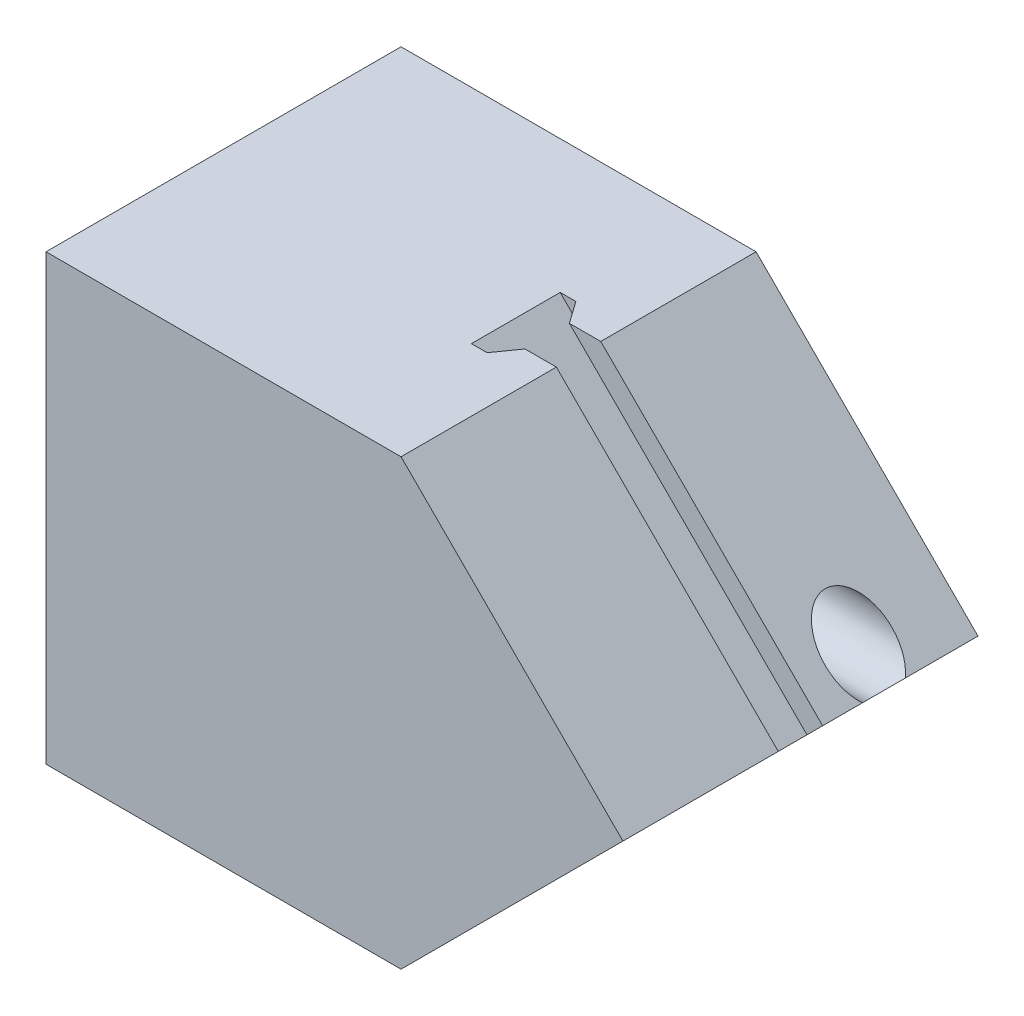
ISO-10303-21;
HEADER;
FILE_DESCRIPTION(('STEP AP214'),'2;1');
FILE_NAME('part.step','',(''),(''),'','','');
FILE_SCHEMA(('AUTOMOTIVE_DESIGN { 1 0 10303 214 1 1 1 1 }'));
ENDSEC;
DATA;
#1=APPLICATION_CONTEXT('core data for automotive mechanical design processes');
#2=APPLICATION_PROTOCOL_DEFINITION('international standard','automotive_design',2000,#1);
#3=PRODUCT_CONTEXT('',#1,'mechanical');
#4=PRODUCT('Part','Part','',(#3));
#5=PRODUCT_RELATED_PRODUCT_CATEGORY('part','',(#4));
#6=PRODUCT_DEFINITION_FORMATION('','',#4);
#7=PRODUCT_DEFINITION_CONTEXT('part definition',#1,'design');
#8=PRODUCT_DEFINITION('design','',#6,#7);
#9=PRODUCT_DEFINITION_SHAPE('','',#8);
#10=(LENGTH_UNIT() NAMED_UNIT(*) SI_UNIT(.MILLI.,.METRE.));
#11=(NAMED_UNIT(*) PLANE_ANGLE_UNIT() SI_UNIT($,.RADIAN.));
#12=(NAMED_UNIT(*) SI_UNIT($,.STERADIAN.) SOLID_ANGLE_UNIT());
#13=UNCERTAINTY_MEASURE_WITH_UNIT(LENGTH_MEASURE(1.E-05),#10,'distance_accuracy_value','');
#14=(GEOMETRIC_REPRESENTATION_CONTEXT(3) GLOBAL_UNCERTAINTY_ASSIGNED_CONTEXT((#13)) GLOBAL_UNIT_ASSIGNED_CONTEXT((#10,
#11,#12)) REPRESENTATION_CONTEXT('',''));
#15=CARTESIAN_POINT('',(0.,0.,0.));
#16=DIRECTION('',(0.,0.,1.));
#17=DIRECTION('',(1.,0.,0.));
#18=AXIS2_PLACEMENT_3D('',#15,#16,#17);
#19=CARTESIAN_POINT('',(-50.0000000000005,50.,40.));
#20=DIRECTION('',(-0.707106781186544,-0.707106781186551,0.));
#21=DIRECTION('',(0.707106781186551,-0.707106781186544,0.));
#22=AXIS2_PLACEMENT_3D('',#19,#20,#21);
#23=PLANE('',#22);
#24=DIRECTION('',(-0.707106781186551,0.707106781186544,0.));
#25=VECTOR('',#24,1.);
#26=CARTESIAN_POINT('',(-50.0000000000005,50.,-5.));
#27=LINE('',#26,#25);
#28=CARTESIAN_POINT('',(0.,0.,-5.));
#29=VERTEX_POINT('',#28);
#30=CARTESIAN_POINT('',(-50.0000000000005,50.,-5.));
#31=VERTEX_POINT('',#30);
#32=EDGE_CURVE('E260',#29,#31,#27,.T.);
#33=ORIENTED_EDGE('',*,*,#32,.F.);
#34=DIRECTION('',(0.,0.,-1.));
#35=VECTOR('',#34,1.);
#36=CARTESIAN_POINT('',(0.,0.,40.));
#37=LINE('',#36,#35);
#38=CARTESIAN_POINT('',(0.,0.,-13.971980510103));
#39=VERTEX_POINT('',#38);
#40=EDGE_CURVE('E171',#29,#39,#37,.T.);
#41=ORIENTED_EDGE('',*,*,#40,.T.);
#42=CARTESIAN_POINT('',(-5.73323446594282,5.73323446594276,-18.8072698042948));
#43=DIRECTION('',(-0.707106781186544,-0.707106781186551,0.));
#44=DIRECTION('',(-0.707106781186551,0.707106781186544,0.));
#45=AXIS2_PLACEMENT_3D('',#42,#43,#44);
#46=ELLIPSE('',#45,10.6066017177983,7.5);
#47=CARTESIAN_POINT('',(0.,0.,-23.6425590984867));
#48=VERTEX_POINT('',#47);
#49=EDGE_CURVE('E227',#39,#48,#46,.T.);
#50=ORIENTED_EDGE('',*,*,#49,.T.);
#51=CARTESIAN_POINT('',(0.,0.,-40.));
#52=VERTEX_POINT('',#51);
#53=EDGE_CURVE('E172',#48,#52,#37,.T.);
#54=ORIENTED_EDGE('',*,*,#53,.T.);
#55=DIRECTION('',(-0.707106781186551,0.707106781186544,0.));
#56=VECTOR('',#55,1.);
#57=CARTESIAN_POINT('',(-50.0000000000005,50.,-40.));
#58=LINE('',#57,#56);
#59=CARTESIAN_POINT('',(-50.0000000000005,50.,-40.));
#60=VERTEX_POINT('',#59);
#61=EDGE_CURVE('E163',#52,#60,#58,.T.);
#62=ORIENTED_EDGE('',*,*,#61,.T.);
#63=DIRECTION('',(0.,0.,-1.));
#64=VECTOR('',#63,1.);
#65=CARTESIAN_POINT('',(-50.0000000000005,50.,40.));
#66=LINE('',#65,#64);
#67=EDGE_CURVE('E174',#31,#60,#66,.T.);
#68=ORIENTED_EDGE('',*,*,#67,.F.);
#69=EDGE_LOOP('',(#33,#41,#50,#54,#62,#68));
#70=FACE_BOUND('',#69,.T.);
#71=ADVANCED_FACE('F38',(#70),#23,.F.);
#72=DIRECTION('',(0.707106781186551,-0.707106781186544,0.));
#73=VECTOR('',#72,1.);
#74=CARTESIAN_POINT('',(-50.0000000000005,50.,5.));
#75=LINE('',#74,#73);
#76=CARTESIAN_POINT('',(-50.0000000000005,50.,5.));
#77=VERTEX_POINT('',#76);
#78=CARTESIAN_POINT('',(0.,0.,5.));
#79=VERTEX_POINT('',#78);
#80=EDGE_CURVE('E61',#77,#79,#75,.T.);
#81=ORIENTED_EDGE('',*,*,#80,.F.);
#82=CARTESIAN_POINT('',(-50.0000000000005,50.,40.));
#83=VERTEX_POINT('',#82);
#84=EDGE_CURVE('E175',#83,#77,#66,.T.);
#85=ORIENTED_EDGE('',*,*,#84,.F.);
#86=DIRECTION('',(-0.707106781186551,0.707106781186544,0.));
#87=VECTOR('',#86,1.);
#88=CARTESIAN_POINT('',(-50.0000000000005,50.,40.));
#89=LINE('',#88,#87);
#90=CARTESIAN_POINT('',(0.,0.,40.));
#91=VERTEX_POINT('',#90);
#92=EDGE_CURVE('E161',#91,#83,#89,.T.);
#93=ORIENTED_EDGE('',*,*,#92,.F.);
#94=EDGE_CURVE('E167',#91,#79,#37,.T.);
#95=ORIENTED_EDGE('',*,*,#94,.T.);
#96=EDGE_LOOP('',(#81,#85,#93,#95));
#97=FACE_BOUND('',#96,.T.);
#98=ADVANCED_FACE('F282',(#97),#23,.F.);
#99=CARTESIAN_POINT('',(-140.,50.,40.));
#100=DIRECTION('',(0.,-1.,0.));
#101=DIRECTION('',(1.,0.,0.));
#102=AXIS2_PLACEMENT_3D('',#99,#100,#101);
#103=PLANE('',#102);
#104=DIRECTION('',(-1.,0.,0.));
#105=VECTOR('',#104,1.);
#106=CARTESIAN_POINT('',(-140.,50.,-40.));
#107=LINE('',#106,#105);
#108=CARTESIAN_POINT('',(-130.,50.,-40.));
#109=VERTEX_POINT('',#108);
#110=EDGE_CURVE('E159',#60,#109,#107,.T.);
#111=ORIENTED_EDGE('',*,*,#110,.T.);
#112=DIRECTION('',(0.,0.,1.));
#113=VECTOR('',#112,1.);
#114=CARTESIAN_POINT('',(-130.,50.,40.));
#115=LINE('',#114,#113);
#116=CARTESIAN_POINT('',(-130.,50.,40.));
#117=VERTEX_POINT('',#116);
#118=EDGE_CURVE('E53',#109,#117,#115,.T.);
#119=ORIENTED_EDGE('',*,*,#118,.T.);
#120=DIRECTION('',(-1.,0.,0.));
#121=VECTOR('',#120,1.);
#122=CARTESIAN_POINT('',(-140.,50.,40.));
#123=LINE('',#122,#121);
#124=EDGE_CURVE('E224',#83,#117,#123,.T.);
#125=ORIENTED_EDGE('',*,*,#124,.F.);
#126=ORIENTED_EDGE('',*,*,#84,.T.);
#127=DIRECTION('',(1.,0.,0.));
#128=VECTOR('',#127,1.);
#129=CARTESIAN_POINT('',(-140.,50.,5.));
#130=LINE('',#129,#128);
#131=CARTESIAN_POINT('',(-57.0710678118661,50.,5.));
#132=VERTEX_POINT('',#131);
#133=EDGE_CURVE('E258',#132,#77,#130,.T.);
#134=ORIENTED_EDGE('',*,*,#133,.F.);
#135=DIRECTION('',(0.577350269189628,0.,-0.816496580927724));
#136=VECTOR('',#135,1.);
#137=CARTESIAN_POINT('',(-101.213203435597,50.,67.4264068711926));
#138=LINE('',#137,#136);
#139=CARTESIAN_POINT('',(-60.6066017177988,50.,9.99999999999999));
#140=VERTEX_POINT('',#139);
#141=EDGE_CURVE('E229',#140,#132,#138,.T.);
#142=ORIENTED_EDGE('',*,*,#141,.F.);
#143=DIRECTION('',(1.,0.,0.));
#144=VECTOR('',#143,1.);
#145=CARTESIAN_POINT('',(-140.,50.,9.99999999999995));
#146=LINE('',#145,#144);
#147=CARTESIAN_POINT('',(-64.1421356237315,50.,9.99999999999999));
#148=VERTEX_POINT('',#147);
#149=EDGE_CURVE('E231',#148,#140,#146,.T.);
#150=ORIENTED_EDGE('',*,*,#149,.F.);
#151=DIRECTION('',(0.,0.,1.));
#152=VECTOR('',#151,1.);
#153=CARTESIAN_POINT('',(-64.1421356237315,50.,40.));
#154=LINE('',#153,#152);
#155=CARTESIAN_POINT('',(-64.1421356237315,50.,-10.));
#156=VERTEX_POINT('',#155);
#157=EDGE_CURVE('E267',#156,#148,#154,.T.);
#158=ORIENTED_EDGE('',*,*,#157,.F.);
#159=DIRECTION('',(-1.,0.,0.));
#160=VECTOR('',#159,1.);
#161=CARTESIAN_POINT('',(-140.,50.,-10.));
#162=LINE('',#161,#160);
#163=CARTESIAN_POINT('',(-60.6066017177988,50.,-10.));
#164=VERTEX_POINT('',#163);
#165=EDGE_CURVE('E265',#164,#156,#162,.T.);
#166=ORIENTED_EDGE('',*,*,#165,.F.);
#167=DIRECTION('',(-0.577350269189626,0.,-0.816496580927726));
#168=VECTOR('',#167,1.);
#169=CARTESIAN_POINT('',(-63.5008417723143,50.,-14.0930735378593));
#170=LINE('',#169,#168);
#171=CARTESIAN_POINT('',(-57.0710678118661,50.,-5.));
#172=VERTEX_POINT('',#171);
#173=EDGE_CURVE('E263',#172,#164,#170,.T.);
#174=ORIENTED_EDGE('',*,*,#173,.F.);
#175=DIRECTION('',(-1.,0.,0.));
#176=VECTOR('',#175,1.);
#177=CARTESIAN_POINT('',(-140.,50.,-5.));
#178=LINE('',#177,#176);
#179=EDGE_CURVE('E208',#31,#172,#178,.T.);
#180=ORIENTED_EDGE('',*,*,#179,.F.);
#181=ORIENTED_EDGE('',*,*,#67,.T.);
#182=EDGE_LOOP('',(#111,#119,#125,#126,#134,#142,#150,#158,#166,#174,#180,#181));
#183=FACE_BOUND('',#182,.T.);
#184=ADVANCED_FACE('F240',(#183),#103,.F.);
#185=CARTESIAN_POINT('',(-50.0000000000005,-50.,40.));
#186=DIRECTION('',(-0.707106781186544,0.707106781186551,0.));
#187=DIRECTION('',(-0.707106781186551,-0.707106781186544,0.));
#188=AXIS2_PLACEMENT_3D('',#185,#186,#187);
#189=PLANE('',#188);
#190=DIRECTION('',(0.707106781186551,0.707106781186544,0.));
#191=VECTOR('',#190,1.);
#192=CARTESIAN_POINT('',(-50.0000000000005,-50.,-5.));
#193=LINE('',#192,#191);
#194=CARTESIAN_POINT('',(-3.53553390593278,-3.53553390593273,-5.));
#195=VERTEX_POINT('',#194);
#196=EDGE_CURVE('E11',#195,#29,#193,.T.);
#197=ORIENTED_EDGE('',*,*,#196,.F.);
#198=DIRECTION('',(0.316227766016839,0.316227766016836,0.894427190999916));
#199=VECTOR('',#198,1.);
#200=CARTESIAN_POINT('',(-0.100505063388386,-0.100505063388379,4.71572875253804));
#201=LINE('',#200,#199);
#202=CARTESIAN_POINT('',(-5.30330085889915,-5.30330085889909,-10.));
#203=VERTEX_POINT('',#202);
#204=EDGE_CURVE('E46',#203,#195,#201,.T.);
#205=ORIENTED_EDGE('',*,*,#204,.F.);
#206=DIRECTION('',(0.707106781186551,0.707106781186544,0.));
#207=VECTOR('',#206,1.);
#208=CARTESIAN_POINT('',(-50.0000000000005,-50.,-10.));
#209=LINE('',#208,#207);
#210=CARTESIAN_POINT('',(-7.07106781186553,-7.07106781186545,-10.));
#211=VERTEX_POINT('',#210);
#212=EDGE_CURVE('E189',#211,#203,#209,.T.);
#213=ORIENTED_EDGE('',*,*,#212,.F.);
#214=DIRECTION('',(0.,0.,-1.));
#215=VECTOR('',#214,1.);
#216=CARTESIAN_POINT('',(-7.07106781186553,-7.07106781186545,40.));
#217=LINE('',#216,#215);
#218=CARTESIAN_POINT('',(-7.07106781186553,-7.07106781186544,9.99999999999999));
#219=VERTEX_POINT('',#218);
#220=EDGE_CURVE('E187',#219,#211,#217,.T.);
#221=ORIENTED_EDGE('',*,*,#220,.F.);
#222=DIRECTION('',(-0.707106781186551,-0.707106781186544,0.));
#223=VECTOR('',#222,1.);
#224=CARTESIAN_POINT('',(-50.0000000000005,-50.,9.99999999999995));
#225=LINE('',#224,#223);
#226=CARTESIAN_POINT('',(-5.30330085889916,-5.30330085889909,9.99999999999999));
#227=VERTEX_POINT('',#226);
#228=EDGE_CURVE('E185',#227,#219,#225,.T.);
#229=ORIENTED_EDGE('',*,*,#228,.F.);
#230=DIRECTION('',(-0.31622776601684,-0.316227766016837,0.894427190999916));
#231=VECTOR('',#230,1.);
#232=CARTESIAN_POINT('',(-22.7279220613581,-22.7279220613578,59.2842712474621));
#233=LINE('',#232,#231);
#234=CARTESIAN_POINT('',(-3.53553390593278,-3.53553390593273,5.));
#235=VERTEX_POINT('',#234);
#236=EDGE_CURVE('E183',#235,#227,#233,.T.);
#237=ORIENTED_EDGE('',*,*,#236,.F.);
#238=DIRECTION('',(-0.707106781186551,-0.707106781186544,0.));
#239=VECTOR('',#238,1.);
#240=CARTESIAN_POINT('',(-50.0000000000005,-50.,5.));
#241=LINE('',#240,#239);
#242=EDGE_CURVE('E181',#79,#235,#241,.T.);
#243=ORIENTED_EDGE('',*,*,#242,.F.);
#244=ORIENTED_EDGE('',*,*,#94,.F.);
#245=DIRECTION('',(0.707106781186551,0.707106781186544,0.));
#246=VECTOR('',#245,1.);
#247=CARTESIAN_POINT('',(-50.0000000000005,-50.,40.));
#248=LINE('',#247,#246);
#249=CARTESIAN_POINT('',(-50.0000000000005,-50.,40.));
#250=VERTEX_POINT('',#249);
#251=EDGE_CURVE('E217',#250,#91,#248,.T.);
#252=ORIENTED_EDGE('',*,*,#251,.F.);
#253=DIRECTION('',(0.,0.,-1.));
#254=VECTOR('',#253,1.);
#255=CARTESIAN_POINT('',(-50.0000000000005,-50.,40.));
#256=LINE('',#255,#254);
#257=CARTESIAN_POINT('',(-50.0000000000005,-50.,-40.));
#258=VERTEX_POINT('',#257);
#259=EDGE_CURVE('E170',#250,#258,#256,.T.);
#260=ORIENTED_EDGE('',*,*,#259,.T.);
#261=DIRECTION('',(0.707106781186551,0.707106781186544,0.));
#262=VECTOR('',#261,1.);
#263=CARTESIAN_POINT('',(-50.0000000000005,-50.,-40.));
#264=LINE('',#263,#262);
#265=EDGE_CURVE('E158',#258,#52,#264,.T.);
#266=ORIENTED_EDGE('',*,*,#265,.T.);
#267=ORIENTED_EDGE('',*,*,#53,.F.);
#268=CARTESIAN_POINT('',(5.73323446594282,5.73323446594276,-18.8072698042948));
#269=DIRECTION('',(-0.707106781186544,0.707106781186551,0.));
#270=DIRECTION('',(-0.707106781186551,-0.707106781186544,0.));
#271=AXIS2_PLACEMENT_3D('',#268,#269,#270);
#272=ELLIPSE('',#271,10.6066017177983,7.5);
#273=EDGE_CURVE('E178',#48,#39,#272,.T.);
#274=ORIENTED_EDGE('',*,*,#273,.T.);
#275=ORIENTED_EDGE('',*,*,#40,.F.);
#276=EDGE_LOOP('',(#197,#205,#213,#221,#229,#237,#243,#244,#252,#260,#266,#267,#274,#275));
#277=FACE_BOUND('',#276,.T.);
#278=ADVANCED_FACE('F212',(#277),#189,.F.);
#279=CARTESIAN_POINT('',(-140.,-50.,40.));
#280=DIRECTION('',(0.,1.,0.));
#281=DIRECTION('',(0.,0.,1.));
#282=AXIS2_PLACEMENT_3D('',#279,#280,#281);
#283=PLANE('',#282);
#284=DIRECTION('',(1.,0.,0.));
#285=VECTOR('',#284,1.);
#286=CARTESIAN_POINT('',(-140.,-50.,40.));
#287=LINE('',#286,#285);
#288=CARTESIAN_POINT('',(-130.,-50.,40.));
#289=VERTEX_POINT('',#288);
#290=EDGE_CURVE('E151',#289,#250,#287,.T.);
#291=ORIENTED_EDGE('',*,*,#290,.F.);
#292=DIRECTION('',(0.,0.,-1.));
#293=VECTOR('',#292,1.);
#294=CARTESIAN_POINT('',(-130.,-50.,40.));
#295=LINE('',#294,#293);
#296=CARTESIAN_POINT('',(-130.,-50.,-40.));
#297=VERTEX_POINT('',#296);
#298=EDGE_CURVE('E138',#289,#297,#295,.T.);
#299=ORIENTED_EDGE('',*,*,#298,.T.);
#300=DIRECTION('',(1.,0.,0.));
#301=VECTOR('',#300,1.);
#302=CARTESIAN_POINT('',(-140.,-50.,-40.));
#303=LINE('',#302,#301);
#304=EDGE_CURVE('E149',#297,#258,#303,.T.);
#305=ORIENTED_EDGE('',*,*,#304,.T.);
#306=ORIENTED_EDGE('',*,*,#259,.F.);
#307=EDGE_LOOP('',(#291,#299,#305,#306));
#308=FACE_BOUND('',#307,.T.);
#309=ADVANCED_FACE('F147',(#308),#283,.F.);
#310=CARTESIAN_POINT('',(0.,0.,40.));
#311=DIRECTION('',(0.,0.,1.));
#312=DIRECTION('',(1.,0.,0.));
#313=AXIS2_PLACEMENT_3D('',#310,#311,#312);
#314=PLANE('',#313);
#315=DIRECTION('',(0.,1.,0.));
#316=VECTOR('',#315,1.);
#317=CARTESIAN_POINT('',(-130.,0.,40.));
#318=LINE('',#317,#316);
#319=EDGE_CURVE('E152',#289,#117,#318,.T.);
#320=ORIENTED_EDGE('',*,*,#319,.F.);
#321=ORIENTED_EDGE('',*,*,#290,.T.);
#322=ORIENTED_EDGE('',*,*,#251,.T.);
#323=ORIENTED_EDGE('',*,*,#92,.T.);
#324=ORIENTED_EDGE('',*,*,#124,.T.);
#325=EDGE_LOOP('',(#320,#321,#322,#323,#324));
#326=FACE_BOUND('',#325,.T.);
#327=ADVANCED_FACE('F236',(#326),#314,.T.);
#328=CARTESIAN_POINT('',(0.,0.,-40.));
#329=DIRECTION('',(0.,0.,1.));
#330=DIRECTION('',(1.,0.,0.));
#331=AXIS2_PLACEMENT_3D('',#328,#329,#330);
#332=PLANE('',#331);
#333=ORIENTED_EDGE('',*,*,#304,.F.);
#334=DIRECTION('',(0.,1.,0.));
#335=VECTOR('',#334,1.);
#336=CARTESIAN_POINT('',(-130.,-69.6914936299047,-40.));
#337=LINE('',#336,#335);
#338=EDGE_CURVE('E135',#297,#109,#337,.T.);
#339=ORIENTED_EDGE('',*,*,#338,.T.);
#340=ORIENTED_EDGE('',*,*,#110,.F.);
#341=ORIENTED_EDGE('',*,*,#61,.F.);
#342=ORIENTED_EDGE('',*,*,#265,.F.);
#343=EDGE_LOOP('',(#333,#339,#340,#341,#342));
#344=FACE_BOUND('',#343,.T.);
#345=ADVANCED_FACE('F155',(#344),#332,.F.);
#346=CARTESIAN_POINT('',(0.,5.73323446594276,-18.8072698042948));
#347=DIRECTION('',(-1.,0.,0.));
#348=DIRECTION('',(0.,0.,1.));
#349=AXIS2_PLACEMENT_3D('',#346,#347,#348);
#350=CYLINDRICAL_SURFACE('',#349,7.5);
#351=CARTESIAN_POINT('',(-130.,5.73323446594276,-18.8072698042948));
#352=DIRECTION('',(1.,0.,0.));
#353=DIRECTION('',(0.,0.,-1.));
#354=AXIS2_PLACEMENT_3D('',#351,#352,#353);
#355=CIRCLE('',#354,7.5);
#356=CARTESIAN_POINT('',(-130.,5.73323446594276,-26.3072698042948));
#357=VERTEX_POINT('',#356);
#358=EDGE_CURVE('E41',#357,#357,#355,.F.);
#359=ORIENTED_EDGE('',*,*,#358,.T.);
#360=EDGE_LOOP('',(#359));
#361=FACE_BOUND('',#360,.T.);
#362=ORIENTED_EDGE('',*,*,#273,.F.);
#363=ORIENTED_EDGE('',*,*,#49,.F.);
#364=EDGE_LOOP('',(#362,#363));
#365=FACE_BOUND('',#364,.T.);
#366=ADVANCED_FACE('F314',(#361,#365),#350,.F.);
#367=CARTESIAN_POINT('',(19.6966991411009,-30.3033008588989,9.99999999999999));
#368=DIRECTION('',(-0.632455532033673,-0.632455532033679,-0.447213595499959));
#369=DIRECTION('',(0.707106781186551,-0.707106781186544,0.));
#370=AXIS2_PLACEMENT_3D('',#367,#368,#369);
#371=PLANE('',#370);
#372=ORIENTED_EDGE('',*,*,#141,.T.);
#373=DIRECTION('',(-0.707106781186551,0.707106781186544,0.));
#374=VECTOR('',#373,1.);
#375=CARTESIAN_POINT('',(21.4644660940673,-28.5355339059325,5.));
#376=LINE('',#375,#374);
#377=EDGE_CURVE('E209',#235,#132,#376,.T.);
#378=ORIENTED_EDGE('',*,*,#377,.F.);
#379=ORIENTED_EDGE('',*,*,#236,.T.);
#380=DIRECTION('',(-0.707106781186551,0.707106781186544,0.));
#381=VECTOR('',#380,1.);
#382=CARTESIAN_POINT('',(19.6966991411009,-30.3033008588989,9.99999999999999));
#383=LINE('',#382,#381);
#384=EDGE_CURVE('E254',#227,#140,#383,.T.);
#385=ORIENTED_EDGE('',*,*,#384,.T.);
#386=EDGE_LOOP('',(#372,#378,#379,#385));
#387=FACE_BOUND('',#386,.T.);
#388=ADVANCED_FACE('F277',(#387),#371,.T.);
#389=CARTESIAN_POINT('',(17.9289321881346,-32.0710678118653,9.99999999999999));
#390=DIRECTION('',(0.,0.,-1.));
#391=DIRECTION('',(0.,1.,0.));
#392=AXIS2_PLACEMENT_3D('',#389,#390,#391);
#393=PLANE('',#392);
#394=ORIENTED_EDGE('',*,*,#149,.T.);
#395=ORIENTED_EDGE('',*,*,#384,.F.);
#396=ORIENTED_EDGE('',*,*,#228,.T.);
#397=DIRECTION('',(-0.707106781186551,0.707106781186544,0.));
#398=VECTOR('',#397,1.);
#399=CARTESIAN_POINT('',(17.9289321881346,-32.0710678118653,9.99999999999999));
#400=LINE('',#399,#398);
#401=EDGE_CURVE('E251',#219,#148,#400,.T.);
#402=ORIENTED_EDGE('',*,*,#401,.T.);
#403=EDGE_LOOP('',(#394,#395,#396,#402));
#404=FACE_BOUND('',#403,.T.);
#405=ADVANCED_FACE('F271',(#404),#393,.T.);
#406=CARTESIAN_POINT('',(17.9289321881346,-32.0710678118653,-10.));
#407=DIRECTION('',(0.707106781186544,0.707106781186551,0.));
#408=DIRECTION('',(-0.707106781186551,0.707106781186544,0.));
#409=AXIS2_PLACEMENT_3D('',#406,#407,#408);
#410=PLANE('',#409);
#411=ORIENTED_EDGE('',*,*,#157,.T.);
#412=ORIENTED_EDGE('',*,*,#401,.F.);
#413=ORIENTED_EDGE('',*,*,#220,.T.);
#414=DIRECTION('',(-0.707106781186551,0.707106781186544,0.));
#415=VECTOR('',#414,1.);
#416=CARTESIAN_POINT('',(17.9289321881346,-32.0710678118653,-10.));
#417=LINE('',#416,#415);
#418=EDGE_CURVE('E248',#211,#156,#417,.T.);
#419=ORIENTED_EDGE('',*,*,#418,.T.);
#420=EDGE_LOOP('',(#411,#412,#413,#419));
#421=FACE_BOUND('',#420,.T.);
#422=ADVANCED_FACE('F285',(#421),#410,.T.);
#423=CARTESIAN_POINT('',(19.6966991411009,-30.3033008588989,-10.));
#424=DIRECTION('',(0.,0.,1.));
#425=DIRECTION('',(1.,0.,0.));
#426=AXIS2_PLACEMENT_3D('',#423,#424,#425);
#427=PLANE('',#426);
#428=ORIENTED_EDGE('',*,*,#165,.T.);
#429=ORIENTED_EDGE('',*,*,#418,.F.);
#430=ORIENTED_EDGE('',*,*,#212,.T.);
#431=DIRECTION('',(-0.707106781186551,0.707106781186544,0.));
#432=VECTOR('',#431,1.);
#433=CARTESIAN_POINT('',(19.6966991411009,-30.3033008588989,-10.));
#434=LINE('',#433,#432);
#435=EDGE_CURVE('E200',#203,#164,#434,.T.);
#436=ORIENTED_EDGE('',*,*,#435,.T.);
#437=EDGE_LOOP('',(#428,#429,#430,#436));
#438=FACE_BOUND('',#437,.T.);
#439=ADVANCED_FACE('F289',(#438),#427,.T.);
#440=CARTESIAN_POINT('',(21.4644660940673,-28.5355339059325,-5.));
#441=DIRECTION('',(-0.632455532033673,-0.632455532033679,0.447213595499957));
#442=DIRECTION('',(0.707106781186551,-0.707106781186544,0.));
#443=AXIS2_PLACEMENT_3D('',#440,#441,#442);
#444=PLANE('',#443);
#445=ORIENTED_EDGE('',*,*,#173,.T.);
#446=ORIENTED_EDGE('',*,*,#435,.F.);
#447=ORIENTED_EDGE('',*,*,#204,.T.);
#448=DIRECTION('',(-0.707106781186551,0.707106781186544,0.));
#449=VECTOR('',#448,1.);
#450=CARTESIAN_POINT('',(21.4644660940673,-28.5355339059325,-5.));
#451=LINE('',#450,#449);
#452=EDGE_CURVE('E197',#195,#172,#451,.T.);
#453=ORIENTED_EDGE('',*,*,#452,.T.);
#454=EDGE_LOOP('',(#445,#446,#447,#453));
#455=FACE_BOUND('',#454,.T.);
#456=ADVANCED_FACE('F196',(#455),#444,.T.);
#457=CARTESIAN_POINT('',(28.5355339059327,-21.464466094067,-5.));
#458=DIRECTION('',(0.,0.,1.));
#459=DIRECTION('',(1.,0.,0.));
#460=AXIS2_PLACEMENT_3D('',#457,#458,#459);
#461=PLANE('',#460);
#462=ORIENTED_EDGE('',*,*,#179,.T.);
#463=ORIENTED_EDGE('',*,*,#452,.F.);
#464=ORIENTED_EDGE('',*,*,#196,.T.);
#465=ORIENTED_EDGE('',*,*,#32,.T.);
#466=EDGE_LOOP('',(#462,#463,#464,#465));
#467=FACE_BOUND('',#466,.T.);
#468=ADVANCED_FACE('F205',(#467),#461,.T.);
#469=CARTESIAN_POINT('',(28.5355339059327,-21.464466094067,5.));
#470=DIRECTION('',(0.,0.,-1.));
#471=DIRECTION('',(-1.,0.,0.));
#472=AXIS2_PLACEMENT_3D('',#469,#470,#471);
#473=PLANE('',#472);
#474=ORIENTED_EDGE('',*,*,#133,.T.);
#475=ORIENTED_EDGE('',*,*,#80,.T.);
#476=ORIENTED_EDGE('',*,*,#242,.T.);
#477=ORIENTED_EDGE('',*,*,#377,.T.);
#478=EDGE_LOOP('',(#474,#475,#476,#477));
#479=FACE_BOUND('',#478,.T.);
#480=ADVANCED_FACE('F280',(#479),#473,.T.);
#481=CARTESIAN_POINT('',(-130.,-69.6914936299047,-40.));
#482=DIRECTION('',(1.,0.,0.));
#483=DIRECTION('',(0.,0.,-1.));
#484=AXIS2_PLACEMENT_3D('',#481,#482,#483);
#485=PLANE('',#484);
#486=ORIENTED_EDGE('',*,*,#358,.F.);
#487=EDGE_LOOP('',(#486));
#488=FACE_BOUND('',#487,.T.);
#489=ORIENTED_EDGE('',*,*,#338,.F.);
#490=ORIENTED_EDGE('',*,*,#298,.F.);
#491=ORIENTED_EDGE('',*,*,#319,.T.);
#492=ORIENTED_EDGE('',*,*,#118,.F.);
#493=EDGE_LOOP('',(#489,#490,#491,#492));
#494=FACE_BOUND('',#493,.T.);
#495=ADVANCED_FACE('F137',(#488,#494),#485,.F.);
#496=CLOSED_SHELL('',(#71,#98,#184,#278,#309,#327,#345,#366,#388,#405,#422,#439,#456,#468,#480,#495));
#497=MANIFOLD_SOLID_BREP('B2',#496);
#498=ADVANCED_BREP_SHAPE_REPRESENTATION('',(#18,#497),#14);
#499=SHAPE_DEFINITION_REPRESENTATION(#9,#498);
ENDSEC;
END-ISO-10303-21;
